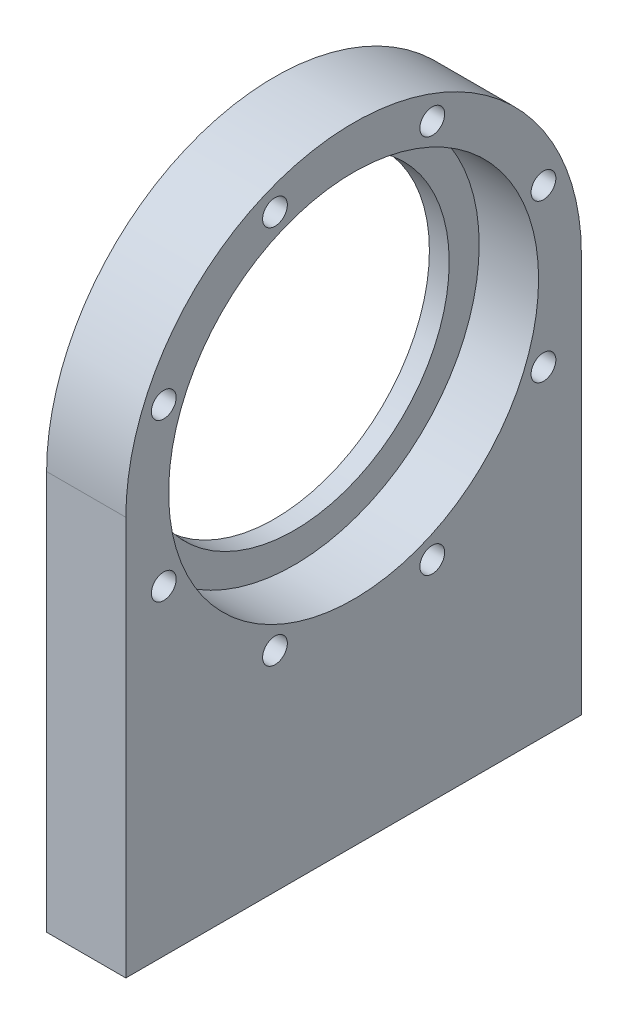
ISO-10303-21;
HEADER;
FILE_DESCRIPTION(('STEP AP214'),'2;1');
FILE_NAME('part.step','',(''),(''),'','','');
FILE_SCHEMA(('AUTOMOTIVE_DESIGN { 1 0 10303 214 1 1 1 1 }'));
ENDSEC;
DATA;
#1=APPLICATION_CONTEXT('core data for automotive mechanical design processes');
#2=APPLICATION_PROTOCOL_DEFINITION('international standard','automotive_design',2000,#1);
#3=PRODUCT_CONTEXT('',#1,'mechanical');
#4=PRODUCT('Part','Part','',(#3));
#5=PRODUCT_RELATED_PRODUCT_CATEGORY('part','',(#4));
#6=PRODUCT_DEFINITION_FORMATION('','',#4);
#7=PRODUCT_DEFINITION_CONTEXT('part definition',#1,'design');
#8=PRODUCT_DEFINITION('design','',#6,#7);
#9=PRODUCT_DEFINITION_SHAPE('','',#8);
#10=(LENGTH_UNIT() NAMED_UNIT(*) SI_UNIT(.MILLI.,.METRE.));
#11=(NAMED_UNIT(*) PLANE_ANGLE_UNIT() SI_UNIT($,.RADIAN.));
#12=(NAMED_UNIT(*) SI_UNIT($,.STERADIAN.) SOLID_ANGLE_UNIT());
#13=UNCERTAINTY_MEASURE_WITH_UNIT(LENGTH_MEASURE(1.E-05),#10,'distance_accuracy_value','');
#14=(GEOMETRIC_REPRESENTATION_CONTEXT(3) GLOBAL_UNCERTAINTY_ASSIGNED_CONTEXT((#13)) GLOBAL_UNIT_ASSIGNED_CONTEXT((#10,
#11,#12)) REPRESENTATION_CONTEXT('',''));
#15=CARTESIAN_POINT('',(0.,0.,0.));
#16=DIRECTION('',(0.,0.,1.));
#17=DIRECTION('',(1.,0.,0.));
#18=AXIS2_PLACEMENT_3D('',#15,#16,#17);
#19=CARTESIAN_POINT('',(8.,0.,0.));
#20=DIRECTION('',(-1.,0.,0.));
#21=DIRECTION('',(0.,0.,1.));
#22=AXIS2_PLACEMENT_3D('',#19,#20,#21);
#23=CYLINDRICAL_SURFACE('',#22,23.);
#24=DIRECTION('',(-1.,0.,0.));
#25=VECTOR('',#24,1.);
#26=CARTESIAN_POINT('',(8.,0.,23.));
#27=LINE('',#26,#25);
#28=CARTESIAN_POINT('',(8.,0.,23.));
#29=VERTEX_POINT('',#28);
#30=CARTESIAN_POINT('',(0.,0.,23.));
#31=VERTEX_POINT('',#30);
#32=EDGE_CURVE('E86',#29,#31,#27,.T.);
#33=ORIENTED_EDGE('',*,*,#32,.F.);
#34=CARTESIAN_POINT('',(8.,0.,0.));
#35=DIRECTION('',(1.,0.,0.));
#36=DIRECTION('',(0.,0.,-1.));
#37=AXIS2_PLACEMENT_3D('',#34,#35,#36);
#38=CIRCLE('',#37,23.);
#39=CARTESIAN_POINT('',(8.,0.,-23.));
#40=VERTEX_POINT('',#39);
#41=EDGE_CURVE('E151',#40,#29,#38,.T.);
#42=ORIENTED_EDGE('',*,*,#41,.F.);
#43=DIRECTION('',(-1.,0.,0.));
#44=VECTOR('',#43,1.);
#45=CARTESIAN_POINT('',(8.,0.,-23.));
#46=LINE('',#45,#44);
#47=CARTESIAN_POINT('',(0.,0.,-23.));
#48=VERTEX_POINT('',#47);
#49=EDGE_CURVE('E100',#40,#48,#46,.T.);
#50=ORIENTED_EDGE('',*,*,#49,.T.);
#51=CARTESIAN_POINT('',(0.,0.,0.));
#52=DIRECTION('',(1.,0.,0.));
#53=DIRECTION('',(0.,0.,-1.));
#54=AXIS2_PLACEMENT_3D('',#51,#52,#53);
#55=CIRCLE('',#54,23.);
#56=EDGE_CURVE('E127',#48,#31,#55,.T.);
#57=ORIENTED_EDGE('',*,*,#56,.T.);
#58=EDGE_LOOP('',(#33,#42,#50,#57));
#59=FACE_BOUND('',#58,.T.);
#60=ADVANCED_FACE('F46',(#59),#23,.T.);
#61=CARTESIAN_POINT('',(2.,0.,0.));
#62=DIRECTION('',(-1.,0.,0.));
#63=DIRECTION('',(0.,0.,1.));
#64=AXIS2_PLACEMENT_3D('',#61,#62,#63);
#65=CYLINDRICAL_SURFACE('',#64,15.6521739130435);
#66=CARTESIAN_POINT('',(2.,0.,0.));
#67=DIRECTION('',(1.,0.,0.));
#68=DIRECTION('',(0.,0.,-1.));
#69=AXIS2_PLACEMENT_3D('',#66,#67,#68);
#70=CIRCLE('',#69,15.6521739130435);
#71=CARTESIAN_POINT('',(2.,0.,-15.6521739130435));
#72=VERTEX_POINT('',#71);
#73=EDGE_CURVE('E11',#72,#72,#70,.T.);
#74=ORIENTED_EDGE('',*,*,#73,.T.);
#75=EDGE_LOOP('',(#74));
#76=FACE_BOUND('',#75,.T.);
#77=CARTESIAN_POINT('',(0.,0.,0.));
#78=DIRECTION('',(1.,0.,0.));
#79=DIRECTION('',(0.,0.,-1.));
#80=AXIS2_PLACEMENT_3D('',#77,#78,#79);
#81=CIRCLE('',#80,15.6521739130435);
#82=CARTESIAN_POINT('',(0.,0.,-15.6521739130435));
#83=VERTEX_POINT('',#82);
#84=EDGE_CURVE('E50',#83,#83,#81,.T.);
#85=ORIENTED_EDGE('',*,*,#84,.F.);
#86=EDGE_LOOP('',(#85));
#87=FACE_BOUND('',#86,.T.);
#88=ADVANCED_FACE('F48',(#76,#87),#65,.F.);
#89=CARTESIAN_POINT('',(2.,0.,0.));
#90=DIRECTION('',(1.,0.,0.));
#91=DIRECTION('',(0.,0.,-1.));
#92=AXIS2_PLACEMENT_3D('',#89,#90,#91);
#93=PLANE('',#92);
#94=ORIENTED_EDGE('',*,*,#73,.F.);
#95=EDGE_LOOP('',(#94));
#96=FACE_BOUND('',#95,.T.);
#97=CARTESIAN_POINT('',(2.,0.,0.));
#98=DIRECTION('',(1.,0.,0.));
#99=DIRECTION('',(0.,0.,-1.));
#100=AXIS2_PLACEMENT_3D('',#97,#98,#99);
#101=CIRCLE('',#100,18.68);
#102=CARTESIAN_POINT('',(2.,0.,-18.68));
#103=VERTEX_POINT('',#102);
#104=EDGE_CURVE('E153',#103,#103,#101,.F.);
#105=ORIENTED_EDGE('',*,*,#104,.F.);
#106=EDGE_LOOP('',(#105));
#107=FACE_BOUND('',#106,.T.);
#108=ADVANCED_FACE('F189',(#96,#107),#93,.T.);
#109=CARTESIAN_POINT('',(0.,0.,0.));
#110=DIRECTION('',(1.,0.,0.));
#111=DIRECTION('',(0.,0.,-1.));
#112=AXIS2_PLACEMENT_3D('',#109,#110,#111);
#113=PLANE('',#112);
#114=ORIENTED_EDGE('',*,*,#84,.T.);
#115=EDGE_LOOP('',(#114));
#116=FACE_BOUND('',#115,.T.);
#117=CARTESIAN_POINT('',(0.,19.1705002996092,7.9406812215757));
#118=DIRECTION('',(1.,0.,0.));
#119=DIRECTION('',(0.,0.,-1.));
#120=AXIS2_PLACEMENT_3D('',#117,#118,#119);
#121=CIRCLE('',#120,1.25);
#122=CARTESIAN_POINT('',(0.,19.1705002996092,6.6906812215757));
#123=VERTEX_POINT('',#122);
#124=EDGE_CURVE('E120',#123,#123,#121,.T.);
#125=ORIENTED_EDGE('',*,*,#124,.T.);
#126=EDGE_LOOP('',(#125));
#127=FACE_BOUND('',#126,.T.);
#128=CARTESIAN_POINT('',(0.,7.94068122157552,19.1705002996092));
#129=DIRECTION('',(1.,0.,0.));
#130=DIRECTION('',(0.,0.,-1.));
#131=AXIS2_PLACEMENT_3D('',#128,#129,#130);
#132=CIRCLE('',#131,1.25);
#133=CARTESIAN_POINT('',(0.,7.94068122157552,17.9205002996092));
#134=VERTEX_POINT('',#133);
#135=EDGE_CURVE('E156',#134,#134,#132,.T.);
#136=ORIENTED_EDGE('',*,*,#135,.T.);
#137=EDGE_LOOP('',(#136));
#138=FACE_BOUND('',#137,.T.);
#139=CARTESIAN_POINT('',(0.,-7.94068122157571,19.1705002996092));
#140=DIRECTION('',(1.,0.,0.));
#141=DIRECTION('',(0.,0.,-1.));
#142=AXIS2_PLACEMENT_3D('',#139,#140,#141);
#143=CIRCLE('',#142,1.25);
#144=CARTESIAN_POINT('',(0.,-7.94068122157571,17.9205002996092));
#145=VERTEX_POINT('',#144);
#146=EDGE_CURVE('E159',#145,#145,#143,.T.);
#147=ORIENTED_EDGE('',*,*,#146,.T.);
#148=EDGE_LOOP('',(#147));
#149=FACE_BOUND('',#148,.T.);
#150=CARTESIAN_POINT('',(0.,-19.1705002996092,7.94068122157552));
#151=DIRECTION('',(1.,0.,0.));
#152=DIRECTION('',(0.,0.,-1.));
#153=AXIS2_PLACEMENT_3D('',#150,#151,#152);
#154=CIRCLE('',#153,1.25);
#155=CARTESIAN_POINT('',(0.,-19.1705002996092,6.69068122157552));
#156=VERTEX_POINT('',#155);
#157=EDGE_CURVE('E162',#156,#156,#154,.T.);
#158=ORIENTED_EDGE('',*,*,#157,.T.);
#159=EDGE_LOOP('',(#158));
#160=FACE_BOUND('',#159,.T.);
#161=CARTESIAN_POINT('',(0.,-19.1705002996092,-7.94068122157571));
#162=DIRECTION('',(1.,0.,0.));
#163=DIRECTION('',(0.,0.,-1.));
#164=AXIS2_PLACEMENT_3D('',#161,#162,#163);
#165=CIRCLE('',#164,1.25);
#166=CARTESIAN_POINT('',(0.,-19.1705002996092,-9.1906812215757));
#167=VERTEX_POINT('',#166);
#168=EDGE_CURVE('E165',#167,#167,#165,.T.);
#169=ORIENTED_EDGE('',*,*,#168,.T.);
#170=EDGE_LOOP('',(#169));
#171=FACE_BOUND('',#170,.T.);
#172=CARTESIAN_POINT('',(0.,-7.94068122157552,-19.1705002996092));
#173=DIRECTION('',(1.,0.,0.));
#174=DIRECTION('',(0.,0.,-1.));
#175=AXIS2_PLACEMENT_3D('',#172,#173,#174);
#176=CIRCLE('',#175,1.25);
#177=CARTESIAN_POINT('',(0.,-7.94068122157552,-20.4205002996092));
#178=VERTEX_POINT('',#177);
#179=EDGE_CURVE('E168',#178,#178,#176,.T.);
#180=ORIENTED_EDGE('',*,*,#179,.T.);
#181=EDGE_LOOP('',(#180));
#182=FACE_BOUND('',#181,.T.);
#183=CARTESIAN_POINT('',(0.,7.94068122157571,-19.1705002996092));
#184=DIRECTION('',(1.,0.,0.));
#185=DIRECTION('',(0.,0.,-1.));
#186=AXIS2_PLACEMENT_3D('',#183,#184,#185);
#187=CIRCLE('',#186,1.25);
#188=CARTESIAN_POINT('',(0.,7.94068122157571,-20.4205002996092));
#189=VERTEX_POINT('',#188);
#190=EDGE_CURVE('E171',#189,#189,#187,.T.);
#191=ORIENTED_EDGE('',*,*,#190,.T.);
#192=EDGE_LOOP('',(#191));
#193=FACE_BOUND('',#192,.T.);
#194=CARTESIAN_POINT('',(0.,19.1705002996092,-7.94068122157552));
#195=DIRECTION('',(1.,0.,0.));
#196=DIRECTION('',(0.,0.,-1.));
#197=AXIS2_PLACEMENT_3D('',#194,#195,#196);
#198=CIRCLE('',#197,1.25);
#199=CARTESIAN_POINT('',(0.,19.1705002996092,-9.19068122157552));
#200=VERTEX_POINT('',#199);
#201=EDGE_CURVE('E174',#200,#200,#198,.T.);
#202=ORIENTED_EDGE('',*,*,#201,.T.);
#203=EDGE_LOOP('',(#202));
#204=FACE_BOUND('',#203,.T.);
#205=ORIENTED_EDGE('',*,*,#56,.F.);
#206=DIRECTION('',(0.,-1.,0.));
#207=VECTOR('',#206,1.);
#208=CARTESIAN_POINT('',(0.,-40.29,-23.));
#209=LINE('',#208,#207);
#210=CARTESIAN_POINT('',(0.,-40.29,-23.));
#211=VERTEX_POINT('',#210);
#212=EDGE_CURVE('E115',#48,#211,#209,.T.);
#213=ORIENTED_EDGE('',*,*,#212,.T.);
#214=DIRECTION('',(0.,0.,1.));
#215=VECTOR('',#214,1.);
#216=CARTESIAN_POINT('',(0.,-40.29,-23.));
#217=LINE('',#216,#215);
#218=CARTESIAN_POINT('',(0.,-40.29,23.));
#219=VERTEX_POINT('',#218);
#220=EDGE_CURVE('E96',#211,#219,#217,.T.);
#221=ORIENTED_EDGE('',*,*,#220,.T.);
#222=DIRECTION('',(0.,1.,0.));
#223=VECTOR('',#222,1.);
#224=CARTESIAN_POINT('',(0.,-40.29,23.));
#225=LINE('',#224,#223);
#226=EDGE_CURVE('E107',#219,#31,#225,.T.);
#227=ORIENTED_EDGE('',*,*,#226,.T.);
#228=EDGE_LOOP('',(#205,#213,#221,#227));
#229=FACE_BOUND('',#228,.T.);
#230=ADVANCED_FACE('F185',(#116,#127,#138,#149,#160,#171,#182,#193,#204,#229),#113,.F.);
#231=CARTESIAN_POINT('',(8.,0.,0.));
#232=DIRECTION('',(-1.,0.,0.));
#233=DIRECTION('',(0.,0.,1.));
#234=AXIS2_PLACEMENT_3D('',#231,#232,#233);
#235=CYLINDRICAL_SURFACE('',#234,18.68);
#236=ORIENTED_EDGE('',*,*,#104,.T.);
#237=EDGE_LOOP('',(#236));
#238=FACE_BOUND('',#237,.T.);
#239=CARTESIAN_POINT('',(8.,0.,0.));
#240=DIRECTION('',(1.,0.,0.));
#241=DIRECTION('',(0.,0.,-1.));
#242=AXIS2_PLACEMENT_3D('',#239,#240,#241);
#243=CIRCLE('',#242,18.68);
#244=CARTESIAN_POINT('',(8.,0.,-18.68));
#245=VERTEX_POINT('',#244);
#246=EDGE_CURVE('E148',#245,#245,#243,.T.);
#247=ORIENTED_EDGE('',*,*,#246,.T.);
#248=EDGE_LOOP('',(#247));
#249=FACE_BOUND('',#248,.T.);
#250=ADVANCED_FACE('F206',(#238,#249),#235,.F.);
#251=CARTESIAN_POINT('',(8.,19.1705002996092,-7.94068122157552));
#252=DIRECTION('',(-1.,0.,0.));
#253=DIRECTION('',(0.,0.,1.));
#254=AXIS2_PLACEMENT_3D('',#251,#252,#253);
#255=CYLINDRICAL_SURFACE('',#254,1.25);
#256=CARTESIAN_POINT('',(8.,19.1705002996092,-7.94068122157552));
#257=DIRECTION('',(1.,0.,0.));
#258=DIRECTION('',(0.,0.,-1.));
#259=AXIS2_PLACEMENT_3D('',#256,#257,#258);
#260=CIRCLE('',#259,1.25);
#261=CARTESIAN_POINT('',(8.,19.1705002996092,-9.19068122157552));
#262=VERTEX_POINT('',#261);
#263=EDGE_CURVE('E145',#262,#262,#260,.T.);
#264=ORIENTED_EDGE('',*,*,#263,.T.);
#265=EDGE_LOOP('',(#264));
#266=FACE_BOUND('',#265,.T.);
#267=ORIENTED_EDGE('',*,*,#201,.F.);
#268=EDGE_LOOP('',(#267));
#269=FACE_BOUND('',#268,.T.);
#270=ADVANCED_FACE('F209',(#266,#269),#255,.F.);
#271=CARTESIAN_POINT('',(8.,7.94068122157571,-19.1705002996092));
#272=DIRECTION('',(-1.,0.,0.));
#273=DIRECTION('',(0.,0.,1.));
#274=AXIS2_PLACEMENT_3D('',#271,#272,#273);
#275=CYLINDRICAL_SURFACE('',#274,1.25);
#276=CARTESIAN_POINT('',(8.,7.94068122157571,-19.1705002996092));
#277=DIRECTION('',(1.,0.,0.));
#278=DIRECTION('',(0.,0.,-1.));
#279=AXIS2_PLACEMENT_3D('',#276,#277,#278);
#280=CIRCLE('',#279,1.25);
#281=CARTESIAN_POINT('',(8.,7.94068122157571,-20.4205002996092));
#282=VERTEX_POINT('',#281);
#283=EDGE_CURVE('E142',#282,#282,#280,.T.);
#284=ORIENTED_EDGE('',*,*,#283,.T.);
#285=EDGE_LOOP('',(#284));
#286=FACE_BOUND('',#285,.T.);
#287=ORIENTED_EDGE('',*,*,#190,.F.);
#288=EDGE_LOOP('',(#287));
#289=FACE_BOUND('',#288,.T.);
#290=ADVANCED_FACE('F212',(#286,#289),#275,.F.);
#291=CARTESIAN_POINT('',(8.,-7.94068122157552,-19.1705002996092));
#292=DIRECTION('',(-1.,0.,0.));
#293=DIRECTION('',(0.,0.,1.));
#294=AXIS2_PLACEMENT_3D('',#291,#292,#293);
#295=CYLINDRICAL_SURFACE('',#294,1.25);
#296=CARTESIAN_POINT('',(8.,-7.94068122157552,-19.1705002996092));
#297=DIRECTION('',(1.,0.,0.));
#298=DIRECTION('',(0.,0.,-1.));
#299=AXIS2_PLACEMENT_3D('',#296,#297,#298);
#300=CIRCLE('',#299,1.25);
#301=CARTESIAN_POINT('',(8.,-7.94068122157552,-20.4205002996092));
#302=VERTEX_POINT('',#301);
#303=EDGE_CURVE('E139',#302,#302,#300,.T.);
#304=ORIENTED_EDGE('',*,*,#303,.T.);
#305=EDGE_LOOP('',(#304));
#306=FACE_BOUND('',#305,.T.);
#307=ORIENTED_EDGE('',*,*,#179,.F.);
#308=EDGE_LOOP('',(#307));
#309=FACE_BOUND('',#308,.T.);
#310=ADVANCED_FACE('F216',(#306,#309),#295,.F.);
#311=CARTESIAN_POINT('',(8.,-19.1705002996092,-7.94068122157571));
#312=DIRECTION('',(-1.,0.,0.));
#313=DIRECTION('',(0.,0.,1.));
#314=AXIS2_PLACEMENT_3D('',#311,#312,#313);
#315=CYLINDRICAL_SURFACE('',#314,1.25);
#316=CARTESIAN_POINT('',(8.,-19.1705002996092,-7.94068122157571));
#317=DIRECTION('',(1.,0.,0.));
#318=DIRECTION('',(0.,0.,-1.));
#319=AXIS2_PLACEMENT_3D('',#316,#317,#318);
#320=CIRCLE('',#319,1.25);
#321=CARTESIAN_POINT('',(8.,-19.1705002996092,-9.1906812215757));
#322=VERTEX_POINT('',#321);
#323=EDGE_CURVE('E136',#322,#322,#320,.T.);
#324=ORIENTED_EDGE('',*,*,#323,.T.);
#325=EDGE_LOOP('',(#324));
#326=FACE_BOUND('',#325,.T.);
#327=ORIENTED_EDGE('',*,*,#168,.F.);
#328=EDGE_LOOP('',(#327));
#329=FACE_BOUND('',#328,.T.);
#330=ADVANCED_FACE('F220',(#326,#329),#315,.F.);
#331=CARTESIAN_POINT('',(8.,-19.1705002996092,7.94068122157552));
#332=DIRECTION('',(-1.,0.,0.));
#333=DIRECTION('',(0.,0.,1.));
#334=AXIS2_PLACEMENT_3D('',#331,#332,#333);
#335=CYLINDRICAL_SURFACE('',#334,1.25);
#336=CARTESIAN_POINT('',(8.,-19.1705002996092,7.94068122157552));
#337=DIRECTION('',(1.,0.,0.));
#338=DIRECTION('',(0.,0.,-1.));
#339=AXIS2_PLACEMENT_3D('',#336,#337,#338);
#340=CIRCLE('',#339,1.25);
#341=CARTESIAN_POINT('',(8.,-19.1705002996092,6.69068122157552));
#342=VERTEX_POINT('',#341);
#343=EDGE_CURVE('E133',#342,#342,#340,.T.);
#344=ORIENTED_EDGE('',*,*,#343,.T.);
#345=EDGE_LOOP('',(#344));
#346=FACE_BOUND('',#345,.T.);
#347=ORIENTED_EDGE('',*,*,#157,.F.);
#348=EDGE_LOOP('',(#347));
#349=FACE_BOUND('',#348,.T.);
#350=ADVANCED_FACE('F224',(#346,#349),#335,.F.);
#351=CARTESIAN_POINT('',(8.,-7.94068122157571,19.1705002996092));
#352=DIRECTION('',(-1.,0.,0.));
#353=DIRECTION('',(0.,0.,1.));
#354=AXIS2_PLACEMENT_3D('',#351,#352,#353);
#355=CYLINDRICAL_SURFACE('',#354,1.25);
#356=CARTESIAN_POINT('',(8.,-7.94068122157571,19.1705002996092));
#357=DIRECTION('',(1.,0.,0.));
#358=DIRECTION('',(0.,0.,-1.));
#359=AXIS2_PLACEMENT_3D('',#356,#357,#358);
#360=CIRCLE('',#359,1.25);
#361=CARTESIAN_POINT('',(8.,-7.94068122157571,17.9205002996092));
#362=VERTEX_POINT('',#361);
#363=EDGE_CURVE('E130',#362,#362,#360,.T.);
#364=ORIENTED_EDGE('',*,*,#363,.T.);
#365=EDGE_LOOP('',(#364));
#366=FACE_BOUND('',#365,.T.);
#367=ORIENTED_EDGE('',*,*,#146,.F.);
#368=EDGE_LOOP('',(#367));
#369=FACE_BOUND('',#368,.T.);
#370=ADVANCED_FACE('F228',(#366,#369),#355,.F.);
#371=CARTESIAN_POINT('',(8.,7.94068122157552,19.1705002996092));
#372=DIRECTION('',(-1.,0.,0.));
#373=DIRECTION('',(0.,0.,1.));
#374=AXIS2_PLACEMENT_3D('',#371,#372,#373);
#375=CYLINDRICAL_SURFACE('',#374,1.25);
#376=CARTESIAN_POINT('',(8.,7.94068122157552,19.1705002996092));
#377=DIRECTION('',(1.,0.,0.));
#378=DIRECTION('',(0.,0.,-1.));
#379=AXIS2_PLACEMENT_3D('',#376,#377,#378);
#380=CIRCLE('',#379,1.25);
#381=CARTESIAN_POINT('',(8.,7.94068122157552,17.9205002996092));
#382=VERTEX_POINT('',#381);
#383=EDGE_CURVE('E126',#382,#382,#380,.T.);
#384=ORIENTED_EDGE('',*,*,#383,.T.);
#385=EDGE_LOOP('',(#384));
#386=FACE_BOUND('',#385,.T.);
#387=ORIENTED_EDGE('',*,*,#135,.F.);
#388=EDGE_LOOP('',(#387));
#389=FACE_BOUND('',#388,.T.);
#390=ADVANCED_FACE('F232',(#386,#389),#375,.F.);
#391=CARTESIAN_POINT('',(8.,19.1705002996092,7.9406812215757));
#392=DIRECTION('',(-1.,0.,0.));
#393=DIRECTION('',(0.,0.,1.));
#394=AXIS2_PLACEMENT_3D('',#391,#392,#393);
#395=CYLINDRICAL_SURFACE('',#394,1.25);
#396=CARTESIAN_POINT('',(8.,19.1705002996092,7.9406812215757));
#397=DIRECTION('',(1.,0.,0.));
#398=DIRECTION('',(0.,0.,-1.));
#399=AXIS2_PLACEMENT_3D('',#396,#397,#398);
#400=CIRCLE('',#399,1.25);
#401=CARTESIAN_POINT('',(8.,19.1705002996092,6.6906812215757));
#402=VERTEX_POINT('',#401);
#403=EDGE_CURVE('E123',#402,#402,#400,.T.);
#404=ORIENTED_EDGE('',*,*,#403,.T.);
#405=EDGE_LOOP('',(#404));
#406=FACE_BOUND('',#405,.T.);
#407=ORIENTED_EDGE('',*,*,#124,.F.);
#408=EDGE_LOOP('',(#407));
#409=FACE_BOUND('',#408,.T.);
#410=ADVANCED_FACE('F236',(#406,#409),#395,.F.);
#411=CARTESIAN_POINT('',(8.,0.,0.));
#412=DIRECTION('',(1.,0.,0.));
#413=DIRECTION('',(0.,0.,-1.));
#414=AXIS2_PLACEMENT_3D('',#411,#412,#413);
#415=PLANE('',#414);
#416=ORIENTED_EDGE('',*,*,#403,.F.);
#417=EDGE_LOOP('',(#416));
#418=FACE_BOUND('',#417,.T.);
#419=ORIENTED_EDGE('',*,*,#383,.F.);
#420=EDGE_LOOP('',(#419));
#421=FACE_BOUND('',#420,.T.);
#422=ORIENTED_EDGE('',*,*,#363,.F.);
#423=EDGE_LOOP('',(#422));
#424=FACE_BOUND('',#423,.T.);
#425=ORIENTED_EDGE('',*,*,#343,.F.);
#426=EDGE_LOOP('',(#425));
#427=FACE_BOUND('',#426,.T.);
#428=ORIENTED_EDGE('',*,*,#323,.F.);
#429=EDGE_LOOP('',(#428));
#430=FACE_BOUND('',#429,.T.);
#431=ORIENTED_EDGE('',*,*,#303,.F.);
#432=EDGE_LOOP('',(#431));
#433=FACE_BOUND('',#432,.T.);
#434=ORIENTED_EDGE('',*,*,#283,.F.);
#435=EDGE_LOOP('',(#434));
#436=FACE_BOUND('',#435,.T.);
#437=ORIENTED_EDGE('',*,*,#263,.F.);
#438=EDGE_LOOP('',(#437));
#439=FACE_BOUND('',#438,.T.);
#440=ORIENTED_EDGE('',*,*,#246,.F.);
#441=EDGE_LOOP('',(#440));
#442=FACE_BOUND('',#441,.T.);
#443=ORIENTED_EDGE('',*,*,#41,.T.);
#444=DIRECTION('',(0.,1.,0.));
#445=VECTOR('',#444,1.);
#446=CARTESIAN_POINT('',(8.,-40.29,23.));
#447=LINE('',#446,#445);
#448=CARTESIAN_POINT('',(8.,-40.29,23.));
#449=VERTEX_POINT('',#448);
#450=EDGE_CURVE('E70',#449,#29,#447,.T.);
#451=ORIENTED_EDGE('',*,*,#450,.F.);
#452=DIRECTION('',(0.,0.,1.));
#453=VECTOR('',#452,1.);
#454=CARTESIAN_POINT('',(8.,-40.29,-23.));
#455=LINE('',#454,#453);
#456=CARTESIAN_POINT('',(8.,-40.29,-23.));
#457=VERTEX_POINT('',#456);
#458=EDGE_CURVE('E94',#457,#449,#455,.T.);
#459=ORIENTED_EDGE('',*,*,#458,.F.);
#460=DIRECTION('',(0.,-1.,0.));
#461=VECTOR('',#460,1.);
#462=CARTESIAN_POINT('',(8.,-40.29,-23.));
#463=LINE('',#462,#461);
#464=EDGE_CURVE('E61',#40,#457,#463,.T.);
#465=ORIENTED_EDGE('',*,*,#464,.F.);
#466=EDGE_LOOP('',(#443,#451,#459,#465));
#467=FACE_BOUND('',#466,.T.);
#468=ADVANCED_FACE('F102',(#418,#421,#424,#427,#430,#433,#436,#439,#442,#467),#415,.T.);
#469=CARTESIAN_POINT('',(8.,-40.29,23.));
#470=DIRECTION('',(0.,0.,1.));
#471=DIRECTION('',(1.,0.,0.));
#472=AXIS2_PLACEMENT_3D('',#469,#470,#471);
#473=PLANE('',#472);
#474=ORIENTED_EDGE('',*,*,#226,.F.);
#475=DIRECTION('',(-1.,0.,0.));
#476=VECTOR('',#475,1.);
#477=CARTESIAN_POINT('',(8.,-40.29,23.));
#478=LINE('',#477,#476);
#479=EDGE_CURVE('E99',#449,#219,#478,.T.);
#480=ORIENTED_EDGE('',*,*,#479,.F.);
#481=ORIENTED_EDGE('',*,*,#450,.T.);
#482=ORIENTED_EDGE('',*,*,#32,.T.);
#483=EDGE_LOOP('',(#474,#480,#481,#482));
#484=FACE_BOUND('',#483,.T.);
#485=ADVANCED_FACE('F287',(#484),#473,.T.);
#486=CARTESIAN_POINT('',(8.,-40.29,-23.));
#487=DIRECTION('',(0.,-1.,0.));
#488=DIRECTION('',(0.,0.,-1.));
#489=AXIS2_PLACEMENT_3D('',#486,#487,#488);
#490=PLANE('',#489);
#491=CARTESIAN_POINT('',(4.,-40.29,-19.));
#492=DIRECTION('',(0.,1.,0.));
#493=DIRECTION('',(0.,0.,1.));
#494=AXIS2_PLACEMENT_3D('',#491,#492,#493);
#495=CIRCLE('',#494,1.8);
#496=CARTESIAN_POINT('',(4.,-40.29,-17.2));
#497=VERTEX_POINT('',#496);
#498=EDGE_CURVE('E442',#497,#497,#495,.T.);
#499=ORIENTED_EDGE('',*,*,#498,.T.);
#500=EDGE_LOOP('',(#499));
#501=FACE_BOUND('',#500,.T.);
#502=CARTESIAN_POINT('',(4.,-40.29,19.));
#503=DIRECTION('',(0.,-1.,0.));
#504=DIRECTION('',(0.,0.,-1.));
#505=AXIS2_PLACEMENT_3D('',#502,#503,#504);
#506=CIRCLE('',#505,1.8);
#507=CARTESIAN_POINT('',(4.,-40.29,17.2));
#508=VERTEX_POINT('',#507);
#509=EDGE_CURVE('E111',#508,#508,#506,.T.);
#510=ORIENTED_EDGE('',*,*,#509,.F.);
#511=EDGE_LOOP('',(#510));
#512=FACE_BOUND('',#511,.T.);
#513=ORIENTED_EDGE('',*,*,#220,.F.);
#514=DIRECTION('',(-1.,0.,0.));
#515=VECTOR('',#514,1.);
#516=CARTESIAN_POINT('',(8.,-40.29,-23.));
#517=LINE('',#516,#515);
#518=EDGE_CURVE('E92',#457,#211,#517,.T.);
#519=ORIENTED_EDGE('',*,*,#518,.F.);
#520=ORIENTED_EDGE('',*,*,#458,.T.);
#521=ORIENTED_EDGE('',*,*,#479,.T.);
#522=EDGE_LOOP('',(#513,#519,#520,#521));
#523=FACE_BOUND('',#522,.T.);
#524=ADVANCED_FACE('F93',(#501,#512,#523),#490,.T.);
#525=CARTESIAN_POINT('',(8.,-40.29,-23.));
#526=DIRECTION('',(0.,0.,-1.));
#527=DIRECTION('',(-1.,0.,0.));
#528=AXIS2_PLACEMENT_3D('',#525,#526,#527);
#529=PLANE('',#528);
#530=ORIENTED_EDGE('',*,*,#212,.F.);
#531=ORIENTED_EDGE('',*,*,#49,.F.);
#532=ORIENTED_EDGE('',*,*,#464,.T.);
#533=ORIENTED_EDGE('',*,*,#518,.T.);
#534=EDGE_LOOP('',(#530,#531,#532,#533));
#535=FACE_BOUND('',#534,.T.);
#536=ADVANCED_FACE('F104',(#535),#529,.T.);
#537=CARTESIAN_POINT('',(4.,-35.29,19.));
#538=DIRECTION('',(0.,-1.,0.));
#539=DIRECTION('',(0.,0.,-1.));
#540=AXIS2_PLACEMENT_3D('',#537,#538,#539);
#541=CYLINDRICAL_SURFACE('',#540,1.8);
#542=CARTESIAN_POINT('',(4.,-35.29,19.));
#543=DIRECTION('',(0.,-1.,0.));
#544=DIRECTION('',(0.,0.,-1.));
#545=AXIS2_PLACEMENT_3D('',#542,#543,#544);
#546=CIRCLE('',#545,1.8);
#547=CARTESIAN_POINT('',(4.,-35.29,17.2));
#548=VERTEX_POINT('',#547);
#549=EDGE_CURVE('E117',#548,#548,#546,.T.);
#550=ORIENTED_EDGE('',*,*,#549,.F.);
#551=EDGE_LOOP('',(#550));
#552=FACE_BOUND('',#551,.T.);
#553=ORIENTED_EDGE('',*,*,#509,.T.);
#554=EDGE_LOOP('',(#553));
#555=FACE_BOUND('',#554,.T.);
#556=ADVANCED_FACE('F309',(#552,#555),#541,.F.);
#557=CARTESIAN_POINT('',(4.,-35.29,19.));
#558=DIRECTION('',(0.,-1.,0.));
#559=DIRECTION('',(0.,0.,-1.));
#560=AXIS2_PLACEMENT_3D('',#557,#558,#559);
#561=PLANE('',#560);
#562=ORIENTED_EDGE('',*,*,#549,.T.);
#563=EDGE_LOOP('',(#562));
#564=FACE_BOUND('',#563,.T.);
#565=ADVANCED_FACE('F315',(#564),#561,.T.);
#566=CARTESIAN_POINT('',(4.,-35.29,-19.));
#567=DIRECTION('',(0.,-1.,0.));
#568=DIRECTION('',(0.,0.,-1.));
#569=AXIS2_PLACEMENT_3D('',#566,#567,#568);
#570=CYLINDRICAL_SURFACE('',#569,1.8);
#571=CARTESIAN_POINT('',(4.,-35.29,-19.));
#572=DIRECTION('',(0.,1.,0.));
#573=DIRECTION('',(0.,0.,1.));
#574=AXIS2_PLACEMENT_3D('',#571,#572,#573);
#575=CIRCLE('',#574,1.8);
#576=CARTESIAN_POINT('',(4.,-35.29,-17.2));
#577=VERTEX_POINT('',#576);
#578=EDGE_CURVE('E441',#577,#577,#575,.T.);
#579=ORIENTED_EDGE('',*,*,#578,.T.);
#580=EDGE_LOOP('',(#579));
#581=FACE_BOUND('',#580,.T.);
#582=ORIENTED_EDGE('',*,*,#498,.F.);
#583=EDGE_LOOP('',(#582));
#584=FACE_BOUND('',#583,.T.);
#585=ADVANCED_FACE('F322',(#581,#584),#570,.F.);
#586=CARTESIAN_POINT('',(4.,-35.29,-19.));
#587=DIRECTION('',(0.,-1.,0.));
#588=DIRECTION('',(0.,0.,1.));
#589=AXIS2_PLACEMENT_3D('',#586,#587,#588);
#590=PLANE('',#589);
#591=ORIENTED_EDGE('',*,*,#578,.F.);
#592=EDGE_LOOP('',(#591));
#593=FACE_BOUND('',#592,.T.);
#594=ADVANCED_FACE('F329',(#593),#590,.T.);
#595=CLOSED_SHELL('',(#60,#88,#108,#230,#250,#270,#290,#310,#330,#350,#370,#390,#410,#468,#485,
#524,#536,#556,#565,#585,#594));
#596=MANIFOLD_SOLID_BREP('B2',#595);
#597=ADVANCED_BREP_SHAPE_REPRESENTATION('',(#18,#596),#14);
#598=SHAPE_DEFINITION_REPRESENTATION(#9,#597);
ENDSEC;
END-ISO-10303-21;
